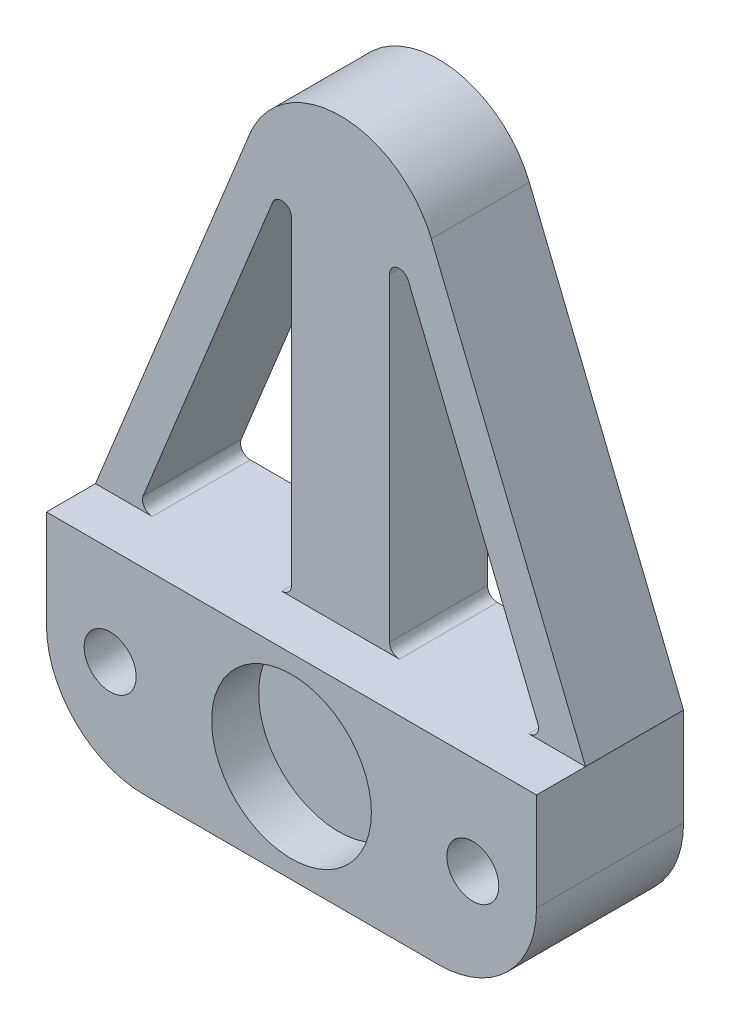
ISO-10303-21;
HEADER;
FILE_DESCRIPTION(('STEP AP214'),'2;1');
FILE_NAME('part.step','',(''),(''),'','','');
FILE_SCHEMA(('AUTOMOTIVE_DESIGN { 1 0 10303 214 1 1 1 1 }'));
ENDSEC;
DATA;
#1=APPLICATION_CONTEXT('core data for automotive mechanical design processes');
#2=APPLICATION_PROTOCOL_DEFINITION('international standard','automotive_design',2000,#1);
#3=PRODUCT_CONTEXT('',#1,'mechanical');
#4=PRODUCT('Part','Part','',(#3));
#5=PRODUCT_RELATED_PRODUCT_CATEGORY('part','',(#4));
#6=PRODUCT_DEFINITION_FORMATION('','',#4);
#7=PRODUCT_DEFINITION_CONTEXT('part definition',#1,'design');
#8=PRODUCT_DEFINITION('design','',#6,#7);
#9=PRODUCT_DEFINITION_SHAPE('','',#8);
#10=(LENGTH_UNIT() NAMED_UNIT(*) SI_UNIT(.MILLI.,.METRE.));
#11=(NAMED_UNIT(*) PLANE_ANGLE_UNIT() SI_UNIT($,.RADIAN.));
#12=(NAMED_UNIT(*) SI_UNIT($,.STERADIAN.) SOLID_ANGLE_UNIT());
#13=UNCERTAINTY_MEASURE_WITH_UNIT(LENGTH_MEASURE(1.E-05),#10,'distance_accuracy_value','');
#14=(GEOMETRIC_REPRESENTATION_CONTEXT(3) GLOBAL_UNCERTAINTY_ASSIGNED_CONTEXT((#13)) GLOBAL_UNIT_ASSIGNED_CONTEXT((#10,
#11,#12)) REPRESENTATION_CONTEXT('',''));
#15=CARTESIAN_POINT('',(0.,0.,0.));
#16=DIRECTION('',(0.,0.,1.));
#17=DIRECTION('',(1.,0.,0.));
#18=AXIS2_PLACEMENT_3D('',#15,#16,#17);
#19=CARTESIAN_POINT('',(0.,45.,6.));
#20=DIRECTION('',(0.,0.,-1.));
#21=DIRECTION('',(-1.,0.,0.));
#22=AXIS2_PLACEMENT_3D('',#19,#20,#21);
#23=CYLINDRICAL_SURFACE('',#22,8.2);
#24=CARTESIAN_POINT('',(0.,45.,0.));
#25=DIRECTION('',(0.,0.,-1.));
#26=DIRECTION('',(-1.,0.,0.));
#27=AXIS2_PLACEMENT_3D('',#24,#25,#26);
#28=CIRCLE('',#27,8.2);
#29=CARTESIAN_POINT('',(-7.66166921648798,42.0778732373286,0.));
#30=VERTEX_POINT('',#29);
#31=CARTESIAN_POINT('',(7.66166921648798,42.0778732373286,0.));
#32=VERTEX_POINT('',#31);
#33=EDGE_CURVE('E224',#30,#32,#28,.T.);
#34=ORIENTED_EDGE('',*,*,#33,.T.);
#35=DIRECTION('',(0.,0.,-1.));
#36=VECTOR('',#35,1.);
#37=CARTESIAN_POINT('',(7.66166921648798,42.0778732373286,6.));
#38=LINE('',#37,#36);
#39=CARTESIAN_POINT('',(7.66166921648798,42.0778732373286,6.));
#40=VERTEX_POINT('',#39);
#41=EDGE_CURVE('E240',#32,#40,#38,.F.);
#42=ORIENTED_EDGE('',*,*,#41,.T.);
#43=CARTESIAN_POINT('',(0.,45.,6.));
#44=DIRECTION('',(0.,0.,-1.));
#45=DIRECTION('',(-1.,0.,0.));
#46=AXIS2_PLACEMENT_3D('',#43,#44,#45);
#47=CIRCLE('',#46,8.2);
#48=CARTESIAN_POINT('',(-7.66166921648798,42.0778732373286,6.));
#49=VERTEX_POINT('',#48);
#50=EDGE_CURVE('E226',#49,#40,#47,.T.);
#51=ORIENTED_EDGE('',*,*,#50,.F.);
#52=DIRECTION('',(0.,0.,-1.));
#53=VECTOR('',#52,1.);
#54=CARTESIAN_POINT('',(-7.66166921648798,42.0778732373286,6.));
#55=LINE('',#54,#53);
#56=EDGE_CURVE('E210',#49,#30,#55,.T.);
#57=ORIENTED_EDGE('',*,*,#56,.T.);
#58=EDGE_LOOP('',(#34,#42,#51,#57));
#59=FACE_BOUND('',#58,.T.);
#60=ADVANCED_FACE('F36',(#59),#23,.F.);
#61=CARTESIAN_POINT('',(0.,0.,15.));
#62=DIRECTION('',(0.,0.,1.));
#63=DIRECTION('',(1.,0.,0.));
#64=AXIS2_PLACEMENT_3D('',#61,#62,#63);
#65=PLANE('',#64);
#66=CARTESIAN_POINT('',(0.,0.,15.));
#67=DIRECTION('',(0.,0.,1.));
#68=DIRECTION('',(1.,0.,0.));
#69=AXIS2_PLACEMENT_3D('',#66,#67,#68);
#70=CIRCLE('',#69,8.15);
#71=CARTESIAN_POINT('',(8.15,0.,15.));
#72=VERTEX_POINT('',#71);
#73=EDGE_CURVE('E271',#72,#72,#70,.T.);
#74=ORIENTED_EDGE('',*,*,#73,.F.);
#75=EDGE_LOOP('',(#74));
#76=FACE_BOUND('',#75,.T.);
#77=CARTESIAN_POINT('',(-18.5,0.,15.));
#78=DIRECTION('',(0.,0.,1.));
#79=DIRECTION('',(1.,0.,0.));
#80=AXIS2_PLACEMENT_3D('',#77,#78,#79);
#81=CIRCLE('',#80,2.65);
#82=CARTESIAN_POINT('',(-15.85,0.,15.));
#83=VERTEX_POINT('',#82);
#84=EDGE_CURVE('E296',#83,#83,#81,.T.);
#85=ORIENTED_EDGE('',*,*,#84,.F.);
#86=EDGE_LOOP('',(#85));
#87=FACE_BOUND('',#86,.T.);
#88=DIRECTION('',(0.,-1.,0.));
#89=VECTOR('',#88,1.);
#90=CARTESIAN_POINT('',(-25.,-10.,15.));
#91=LINE('',#90,#89);
#92=CARTESIAN_POINT('',(-25.,10.,15.));
#93=VERTEX_POINT('',#92);
#94=CARTESIAN_POINT('',(-25.,0.,15.));
#95=VERTEX_POINT('',#94);
#96=EDGE_CURVE('E302',#93,#95,#91,.T.);
#97=ORIENTED_EDGE('',*,*,#96,.T.);
#98=CARTESIAN_POINT('',(-15.,0.,15.));
#99=DIRECTION('',(0.,0.,1.));
#100=DIRECTION('',(1.,0.,0.));
#101=AXIS2_PLACEMENT_3D('',#98,#99,#100);
#102=CIRCLE('',#101,10.);
#103=CARTESIAN_POINT('',(-15.,-10.,15.));
#104=VERTEX_POINT('',#103);
#105=EDGE_CURVE('E44',#95,#104,#102,.T.);
#106=ORIENTED_EDGE('',*,*,#105,.T.);
#107=DIRECTION('',(1.,0.,0.));
#108=VECTOR('',#107,1.);
#109=CARTESIAN_POINT('',(25.,-9.99999999999999,15.));
#110=LINE('',#109,#108);
#111=CARTESIAN_POINT('',(15.,-10.,15.));
#112=VERTEX_POINT('',#111);
#113=EDGE_CURVE('E304',#104,#112,#110,.T.);
#114=ORIENTED_EDGE('',*,*,#113,.T.);
#115=CARTESIAN_POINT('',(15.,0.,15.));
#116=DIRECTION('',(0.,0.,1.));
#117=DIRECTION('',(1.,0.,0.));
#118=AXIS2_PLACEMENT_3D('',#115,#116,#117);
#119=CIRCLE('',#118,10.);
#120=CARTESIAN_POINT('',(25.,0.,15.));
#121=VERTEX_POINT('',#120);
#122=EDGE_CURVE('E51',#112,#121,#119,.T.);
#123=ORIENTED_EDGE('',*,*,#122,.T.);
#124=DIRECTION('',(0.,1.,0.));
#125=VECTOR('',#124,1.);
#126=CARTESIAN_POINT('',(25.,-9.99999999999999,15.));
#127=LINE('',#126,#125);
#128=CARTESIAN_POINT('',(25.,10.,15.));
#129=VERTEX_POINT('',#128);
#130=EDGE_CURVE('E307',#121,#129,#127,.T.);
#131=ORIENTED_EDGE('',*,*,#130,.T.);
#132=DIRECTION('',(-1.,0.,0.));
#133=VECTOR('',#132,1.);
#134=CARTESIAN_POINT('',(25.,10.,15.));
#135=LINE('',#134,#133);
#136=EDGE_CURVE('E309',#129,#93,#135,.T.);
#137=ORIENTED_EDGE('',*,*,#136,.T.);
#138=EDGE_LOOP('',(#97,#106,#114,#123,#131,#137));
#139=FACE_BOUND('',#138,.T.);
#140=CARTESIAN_POINT('',(18.5,0.,15.));
#141=DIRECTION('',(0.,0.,1.));
#142=DIRECTION('',(1.,0.,0.));
#143=AXIS2_PLACEMENT_3D('',#140,#141,#142);
#144=CIRCLE('',#143,2.65);
#145=CARTESIAN_POINT('',(21.15,0.,15.));
#146=VERTEX_POINT('',#145);
#147=EDGE_CURVE('E290',#146,#146,#144,.T.);
#148=ORIENTED_EDGE('',*,*,#147,.F.);
#149=EDGE_LOOP('',(#148));
#150=FACE_BOUND('',#149,.T.);
#151=ADVANCED_FACE('F399',(#76,#87,#139,#150),#65,.T.);
#152=CARTESIAN_POINT('',(0.,0.,0.));
#153=DIRECTION('',(0.,0.,1.));
#154=DIRECTION('',(1.,0.,0.));
#155=AXIS2_PLACEMENT_3D('',#152,#153,#154);
#156=PLANE('',#155);
#157=DIRECTION('',(-1.,0.,0.));
#158=VECTOR('',#157,1.);
#159=CARTESIAN_POINT('',(5.,10.,0.));
#160=LINE('',#159,#158);
#161=CARTESIAN_POINT('',(19.1978264720834,10.,0.));
#162=VERTEX_POINT('',#161);
#163=CARTESIAN_POINT('',(6.,10.,0.));
#164=VERTEX_POINT('',#163);
#165=EDGE_CURVE('E217',#162,#164,#160,.T.);
#166=ORIENTED_EDGE('',*,*,#165,.F.);
#167=CARTESIAN_POINT('',(19.1978264720834,11.,0.));
#168=DIRECTION('',(0.,0.,1.));
#169=DIRECTION('',(1.,0.,0.));
#170=AXIS2_PLACEMENT_3D('',#167,#168,#169);
#171=CIRCLE('',#170,1.);
#172=CARTESIAN_POINT('',(20.1243967674535,11.3761216395501,0.));
#173=VERTEX_POINT('',#172);
#174=EDGE_CURVE('E382',#162,#173,#171,.T.);
#175=ORIENTED_EDGE('',*,*,#174,.T.);
#176=DIRECTION('',(0.376121639550051,-0.926570295370072,0.));
#177=VECTOR('',#176,1.);
#178=CARTESIAN_POINT('',(20.6830042793435,10.,0.));
#179=LINE('',#178,#177);
#180=EDGE_CURVE('E228',#32,#173,#179,.T.);
#181=ORIENTED_EDGE('',*,*,#180,.F.);
#182=ORIENTED_EDGE('',*,*,#33,.F.);
#183=DIRECTION('',(0.376121639550051,0.926570295370072,0.));
#184=VECTOR('',#183,1.);
#185=CARTESIAN_POINT('',(-20.6830042793435,10.,0.));
#186=LINE('',#185,#184);
#187=CARTESIAN_POINT('',(-20.1243967674535,11.37612163955,0.));
#188=VERTEX_POINT('',#187);
#189=EDGE_CURVE('E206',#188,#30,#186,.T.);
#190=ORIENTED_EDGE('',*,*,#189,.F.);
#191=CARTESIAN_POINT('',(-19.1978264720834,11.,0.));
#192=DIRECTION('',(0.,0.,1.));
#193=DIRECTION('',(1.,0.,0.));
#194=AXIS2_PLACEMENT_3D('',#191,#192,#193);
#195=CIRCLE('',#194,1.);
#196=CARTESIAN_POINT('',(-19.1978264720834,10.,0.));
#197=VERTEX_POINT('',#196);
#198=EDGE_CURVE('E365',#188,#197,#195,.T.);
#199=ORIENTED_EDGE('',*,*,#198,.T.);
#200=DIRECTION('',(-1.,0.,0.));
#201=VECTOR('',#200,1.);
#202=CARTESIAN_POINT('',(-5.,10.,0.));
#203=LINE('',#202,#201);
#204=CARTESIAN_POINT('',(-6.,10.,0.));
#205=VERTEX_POINT('',#204);
#206=EDGE_CURVE('E218',#205,#197,#203,.T.);
#207=ORIENTED_EDGE('',*,*,#206,.F.);
#208=CARTESIAN_POINT('',(-6.,11.,0.));
#209=DIRECTION('',(0.,0.,1.));
#210=DIRECTION('',(1.,0.,0.));
#211=AXIS2_PLACEMENT_3D('',#208,#209,#210);
#212=CIRCLE('',#211,1.);
#213=CARTESIAN_POINT('',(-5.,11.,0.));
#214=VERTEX_POINT('',#213);
#215=EDGE_CURVE('E369',#205,#214,#212,.T.);
#216=ORIENTED_EDGE('',*,*,#215,.T.);
#217=DIRECTION('',(0.,-1.,0.));
#218=VECTOR('',#217,1.);
#219=CARTESIAN_POINT('',(-5.,48.6348573955626,0.));
#220=LINE('',#219,#218);
#221=CARTESIAN_POINT('',(-5.,38.5007692762912,0.));
#222=VERTEX_POINT('',#221);
#223=EDGE_CURVE('E511',#222,#214,#220,.T.);
#224=ORIENTED_EDGE('',*,*,#223,.F.);
#225=CARTESIAN_POINT('',(5.,38.5007692762912,0.));
#226=VERTEX_POINT('',#225);
#227=EDGE_CURVE('E235',#226,#222,#28,.T.);
#228=ORIENTED_EDGE('',*,*,#227,.F.);
#229=DIRECTION('',(0.,1.,0.));
#230=VECTOR('',#229,1.);
#231=CARTESIAN_POINT('',(5.,48.6348573955626,0.));
#232=LINE('',#231,#230);
#233=CARTESIAN_POINT('',(5.,11.,0.));
#234=VERTEX_POINT('',#233);
#235=EDGE_CURVE('E504',#234,#226,#232,.T.);
#236=ORIENTED_EDGE('',*,*,#235,.F.);
#237=CARTESIAN_POINT('',(6.,11.,0.));
#238=DIRECTION('',(0.,0.,1.));
#239=DIRECTION('',(1.,0.,0.));
#240=AXIS2_PLACEMENT_3D('',#237,#238,#239);
#241=CIRCLE('',#240,1.);
#242=EDGE_CURVE('E378',#234,#164,#241,.T.);
#243=ORIENTED_EDGE('',*,*,#242,.T.);
#244=EDGE_LOOP('',(#166,#175,#181,#182,#190,#199,#207,#216,#224,#228,#236,#243));
#245=FACE_BOUND('',#244,.T.);
#246=CARTESIAN_POINT('',(0.,0.,0.));
#247=DIRECTION('',(0.,0.,-1.));
#248=DIRECTION('',(-1.,0.,0.));
#249=AXIS2_PLACEMENT_3D('',#246,#247,#248);
#250=CIRCLE('',#249,5.175);
#251=CARTESIAN_POINT('',(-5.175,0.,0.));
#252=VERTEX_POINT('',#251);
#253=EDGE_CURVE('E281',#252,#252,#250,.T.);
#254=ORIENTED_EDGE('',*,*,#253,.F.);
#255=EDGE_LOOP('',(#254));
#256=FACE_BOUND('',#255,.T.);
#257=DIRECTION('',(1.,0.,0.));
#258=VECTOR('',#257,1.);
#259=CARTESIAN_POINT('',(25.,-9.99999999999999,0.));
#260=LINE('',#259,#258);
#261=CARTESIAN_POINT('',(-15.,-10.,0.));
#262=VERTEX_POINT('',#261);
#263=CARTESIAN_POINT('',(15.,-10.,0.));
#264=VERTEX_POINT('',#263);
#265=EDGE_CURVE('E313',#262,#264,#260,.T.);
#266=ORIENTED_EDGE('',*,*,#265,.F.);
#267=CARTESIAN_POINT('',(-15.,0.,0.));
#268=DIRECTION('',(0.,0.,1.));
#269=DIRECTION('',(1.,0.,0.));
#270=AXIS2_PLACEMENT_3D('',#267,#268,#269);
#271=CIRCLE('',#270,10.);
#272=CARTESIAN_POINT('',(-25.,0.,0.));
#273=VERTEX_POINT('',#272);
#274=EDGE_CURVE('E394',#262,#273,#271,.F.);
#275=ORIENTED_EDGE('',*,*,#274,.T.);
#276=DIRECTION('',(0.,-1.,0.));
#277=VECTOR('',#276,1.);
#278=CARTESIAN_POINT('',(-25.,-10.,0.));
#279=LINE('',#278,#277);
#280=CARTESIAN_POINT('',(-25.,10.,0.));
#281=VERTEX_POINT('',#280);
#282=EDGE_CURVE('E299',#281,#273,#279,.T.);
#283=ORIENTED_EDGE('',*,*,#282,.F.);
#284=DIRECTION('',(0.376121639550051,0.926570295370071,0.));
#285=VECTOR('',#284,1.);
#286=CARTESIAN_POINT('',(-25.,10.,0.));
#287=LINE('',#286,#285);
#288=CARTESIAN_POINT('',(-9.26570295370072,48.7612163955005,0.));
#289=VERTEX_POINT('',#288);
#290=EDGE_CURVE('E258',#281,#289,#287,.T.);
#291=ORIENTED_EDGE('',*,*,#290,.T.);
#292=CARTESIAN_POINT('',(0.,45.,0.));
#293=DIRECTION('',(0.,0.,-1.));
#294=DIRECTION('',(-1.,0.,0.));
#295=AXIS2_PLACEMENT_3D('',#292,#293,#294);
#296=CIRCLE('',#295,10.);
#297=CARTESIAN_POINT('',(9.26570295370072,48.7612163955005,0.));
#298=VERTEX_POINT('',#297);
#299=EDGE_CURVE('E261',#289,#298,#296,.T.);
#300=ORIENTED_EDGE('',*,*,#299,.T.);
#301=DIRECTION('',(0.376121639550051,-0.926570295370072,0.));
#302=VECTOR('',#301,1.);
#303=CARTESIAN_POINT('',(9.26570295370072,48.7612163955005,0.));
#304=LINE('',#303,#302);
#305=CARTESIAN_POINT('',(25.,10.,0.));
#306=VERTEX_POINT('',#305);
#307=EDGE_CURVE('E265',#298,#306,#304,.T.);
#308=ORIENTED_EDGE('',*,*,#307,.T.);
#309=DIRECTION('',(0.,1.,0.));
#310=VECTOR('',#309,1.);
#311=CARTESIAN_POINT('',(25.,-9.99999999999999,0.));
#312=LINE('',#311,#310);
#313=CARTESIAN_POINT('',(25.,0.,0.));
#314=VERTEX_POINT('',#313);
#315=EDGE_CURVE('E305',#314,#306,#312,.T.);
#316=ORIENTED_EDGE('',*,*,#315,.F.);
#317=CARTESIAN_POINT('',(15.,0.,0.));
#318=DIRECTION('',(0.,0.,1.));
#319=DIRECTION('',(1.,0.,0.));
#320=AXIS2_PLACEMENT_3D('',#317,#318,#319);
#321=CIRCLE('',#320,10.);
#322=EDGE_CURVE('E392',#314,#264,#321,.F.);
#323=ORIENTED_EDGE('',*,*,#322,.T.);
#324=EDGE_LOOP('',(#266,#275,#283,#291,#300,#308,#316,#323));
#325=FACE_BOUND('',#324,.T.);
#326=CARTESIAN_POINT('',(-18.5,0.,0.));
#327=DIRECTION('',(0.,0.,1.));
#328=DIRECTION('',(1.,0.,0.));
#329=AXIS2_PLACEMENT_3D('',#326,#327,#328);
#330=CIRCLE('',#329,2.65);
#331=CARTESIAN_POINT('',(-15.85,0.,0.));
#332=VERTEX_POINT('',#331);
#333=EDGE_CURVE('E293',#332,#332,#330,.T.);
#334=ORIENTED_EDGE('',*,*,#333,.T.);
#335=EDGE_LOOP('',(#334));
#336=FACE_BOUND('',#335,.T.);
#337=CARTESIAN_POINT('',(18.5,0.,0.));
#338=DIRECTION('',(0.,0.,1.));
#339=DIRECTION('',(1.,0.,0.));
#340=AXIS2_PLACEMENT_3D('',#337,#338,#339);
#341=CIRCLE('',#340,2.65);
#342=CARTESIAN_POINT('',(21.15,0.,0.));
#343=VERTEX_POINT('',#342);
#344=EDGE_CURVE('E287',#343,#343,#341,.T.);
#345=ORIENTED_EDGE('',*,*,#344,.T.);
#346=EDGE_LOOP('',(#345));
#347=FACE_BOUND('',#346,.T.);
#348=ADVANCED_FACE('F232',(#245,#256,#325,#336,#347),#156,.F.);
#349=CARTESIAN_POINT('',(-25.,-10.,15.));
#350=DIRECTION('',(1.,0.,0.));
#351=DIRECTION('',(0.,1.,0.));
#352=AXIS2_PLACEMENT_3D('',#349,#350,#351);
#353=PLANE('',#352);
#354=ORIENTED_EDGE('',*,*,#282,.T.);
#355=DIRECTION('',(0.,0.,-1.));
#356=VECTOR('',#355,1.);
#357=CARTESIAN_POINT('',(-25.,0.,15.));
#358=LINE('',#357,#356);
#359=EDGE_CURVE('E59',#273,#95,#358,.F.);
#360=ORIENTED_EDGE('',*,*,#359,.T.);
#361=ORIENTED_EDGE('',*,*,#96,.F.);
#362=DIRECTION('',(0.,0.,-1.));
#363=VECTOR('',#362,1.);
#364=CARTESIAN_POINT('',(-25.,10.,15.));
#365=LINE('',#364,#363);
#366=CARTESIAN_POINT('',(-25.,10.,10.));
#367=VERTEX_POINT('',#366);
#368=EDGE_CURVE('E311',#93,#367,#365,.T.);
#369=ORIENTED_EDGE('',*,*,#368,.T.);
#370=DIRECTION('',(0.,0.,-1.));
#371=VECTOR('',#370,1.);
#372=CARTESIAN_POINT('',(-25.,10.,10.));
#373=LINE('',#372,#371);
#374=EDGE_CURVE('E257',#367,#281,#373,.T.);
#375=ORIENTED_EDGE('',*,*,#374,.T.);
#376=EDGE_LOOP('',(#354,#360,#361,#369,#375));
#377=FACE_BOUND('',#376,.T.);
#378=ADVANCED_FACE('F411',(#377),#353,.F.);
#379=CARTESIAN_POINT('',(25.,-9.99999999999999,15.));
#380=DIRECTION('',(0.,1.,0.));
#381=DIRECTION('',(-1.,0.,0.));
#382=AXIS2_PLACEMENT_3D('',#379,#380,#381);
#383=PLANE('',#382);
#384=ORIENTED_EDGE('',*,*,#113,.F.);
#385=DIRECTION('',(0.,0.,-1.));
#386=VECTOR('',#385,1.);
#387=CARTESIAN_POINT('',(-15.,-10.,15.));
#388=LINE('',#387,#386);
#389=EDGE_CURVE('E389',#104,#262,#388,.T.);
#390=ORIENTED_EDGE('',*,*,#389,.T.);
#391=ORIENTED_EDGE('',*,*,#265,.T.);
#392=DIRECTION('',(0.,0.,-1.));
#393=VECTOR('',#392,1.);
#394=CARTESIAN_POINT('',(15.,-10.,15.));
#395=LINE('',#394,#393);
#396=EDGE_CURVE('E387',#264,#112,#395,.F.);
#397=ORIENTED_EDGE('',*,*,#396,.T.);
#398=EDGE_LOOP('',(#384,#390,#391,#397));
#399=FACE_BOUND('',#398,.T.);
#400=ADVANCED_FACE('F404',(#399),#383,.F.);
#401=CARTESIAN_POINT('',(25.,-9.99999999999999,15.));
#402=DIRECTION('',(-1.,0.,0.));
#403=DIRECTION('',(0.,0.,1.));
#404=AXIS2_PLACEMENT_3D('',#401,#402,#403);
#405=PLANE('',#404);
#406=ORIENTED_EDGE('',*,*,#130,.F.);
#407=DIRECTION('',(0.,0.,-1.));
#408=VECTOR('',#407,1.);
#409=CARTESIAN_POINT('',(25.,0.,15.));
#410=LINE('',#409,#408);
#411=EDGE_CURVE('E11',#121,#314,#410,.T.);
#412=ORIENTED_EDGE('',*,*,#411,.T.);
#413=ORIENTED_EDGE('',*,*,#315,.T.);
#414=DIRECTION('',(0.,0.,-1.));
#415=VECTOR('',#414,1.);
#416=CARTESIAN_POINT('',(25.,10.,10.));
#417=LINE('',#416,#415);
#418=CARTESIAN_POINT('',(25.,10.,10.));
#419=VERTEX_POINT('',#418);
#420=EDGE_CURVE('E268',#419,#306,#417,.T.);
#421=ORIENTED_EDGE('',*,*,#420,.F.);
#422=DIRECTION('',(0.,0.,-1.));
#423=VECTOR('',#422,1.);
#424=CARTESIAN_POINT('',(25.,10.,15.));
#425=LINE('',#424,#423);
#426=EDGE_CURVE('E319',#129,#419,#425,.T.);
#427=ORIENTED_EDGE('',*,*,#426,.F.);
#428=EDGE_LOOP('',(#406,#412,#413,#421,#427));
#429=FACE_BOUND('',#428,.T.);
#430=ADVANCED_FACE('F427',(#429),#405,.F.);
#431=CARTESIAN_POINT('',(25.,10.,15.));
#432=DIRECTION('',(0.,-1.,0.));
#433=DIRECTION('',(1.,0.,0.));
#434=AXIS2_PLACEMENT_3D('',#431,#432,#433);
#435=PLANE('',#434);
#436=ORIENTED_EDGE('',*,*,#206,.T.);
#437=DIRECTION('',(0.,0.,-1.));
#438=VECTOR('',#437,1.);
#439=CARTESIAN_POINT('',(-19.1978264720834,10.,10.));
#440=LINE('',#439,#438);
#441=CARTESIAN_POINT('',(-19.1978264720834,10.,10.));
#442=VERTEX_POINT('',#441);
#443=EDGE_CURVE('E348',#197,#442,#440,.F.);
#444=ORIENTED_EDGE('',*,*,#443,.T.);
#445=DIRECTION('',(-1.,0.,0.));
#446=VECTOR('',#445,1.);
#447=CARTESIAN_POINT('',(-25.,10.,10.));
#448=LINE('',#447,#446);
#449=EDGE_CURVE('E248',#442,#367,#448,.T.);
#450=ORIENTED_EDGE('',*,*,#449,.T.);
#451=ORIENTED_EDGE('',*,*,#368,.F.);
#452=ORIENTED_EDGE('',*,*,#136,.F.);
#453=ORIENTED_EDGE('',*,*,#426,.T.);
#454=CARTESIAN_POINT('',(19.1978264720834,10.,10.));
#455=VERTEX_POINT('',#454);
#456=EDGE_CURVE('E244',#419,#455,#448,.T.);
#457=ORIENTED_EDGE('',*,*,#456,.T.);
#458=DIRECTION('',(0.,0.,-1.));
#459=VECTOR('',#458,1.);
#460=CARTESIAN_POINT('',(19.1978264720834,10.,0.));
#461=LINE('',#460,#459);
#462=EDGE_CURVE('E339',#455,#162,#461,.T.);
#463=ORIENTED_EDGE('',*,*,#462,.T.);
#464=ORIENTED_EDGE('',*,*,#165,.T.);
#465=DIRECTION('',(0.,0.,-1.));
#466=VECTOR('',#465,1.);
#467=CARTESIAN_POINT('',(6.,10.,10.));
#468=LINE('',#467,#466);
#469=CARTESIAN_POINT('',(5.99999999999999,10.,10.));
#470=VERTEX_POINT('',#469);
#471=EDGE_CURVE('E342',#164,#470,#468,.F.);
#472=ORIENTED_EDGE('',*,*,#471,.T.);
#473=CARTESIAN_POINT('',(-6.,10.,10.));
#474=VERTEX_POINT('',#473);
#475=EDGE_CURVE('E247',#470,#474,#448,.T.);
#476=ORIENTED_EDGE('',*,*,#475,.T.);
#477=DIRECTION('',(0.,0.,-1.));
#478=VECTOR('',#477,1.);
#479=CARTESIAN_POINT('',(-6.,10.,0.));
#480=LINE('',#479,#478);
#481=EDGE_CURVE('E345',#474,#205,#480,.T.);
#482=ORIENTED_EDGE('',*,*,#481,.T.);
#483=EDGE_LOOP('',(#436,#444,#450,#451,#452,#453,#457,#463,#464,#472,#476,#482));
#484=FACE_BOUND('',#483,.T.);
#485=ADVANCED_FACE('F431',(#484),#435,.F.);
#486=CARTESIAN_POINT('',(-18.5,0.,15.));
#487=DIRECTION('',(0.,0.,-1.));
#488=DIRECTION('',(-1.,0.,0.));
#489=AXIS2_PLACEMENT_3D('',#486,#487,#488);
#490=CYLINDRICAL_SURFACE('',#489,2.65);
#491=ORIENTED_EDGE('',*,*,#84,.T.);
#492=EDGE_LOOP('',(#491));
#493=FACE_BOUND('',#492,.T.);
#494=ORIENTED_EDGE('',*,*,#333,.F.);
#495=EDGE_LOOP('',(#494));
#496=FACE_BOUND('',#495,.T.);
#497=ADVANCED_FACE('F574',(#493,#496),#490,.F.);
#498=CARTESIAN_POINT('',(18.5,0.,15.));
#499=DIRECTION('',(0.,0.,-1.));
#500=DIRECTION('',(-1.,0.,0.));
#501=AXIS2_PLACEMENT_3D('',#498,#499,#500);
#502=CYLINDRICAL_SURFACE('',#501,2.65);
#503=ORIENTED_EDGE('',*,*,#147,.T.);
#504=EDGE_LOOP('',(#503));
#505=FACE_BOUND('',#504,.T.);
#506=ORIENTED_EDGE('',*,*,#344,.F.);
#507=EDGE_LOOP('',(#506));
#508=FACE_BOUND('',#507,.T.);
#509=ADVANCED_FACE('F570',(#505,#508),#502,.F.);
#510=CARTESIAN_POINT('',(0.,0.,5.5));
#511=DIRECTION('',(0.,0.,-1.));
#512=DIRECTION('',(-1.,0.,0.));
#513=AXIS2_PLACEMENT_3D('',#510,#511,#512);
#514=CYLINDRICAL_SURFACE('',#513,5.175);
#515=CARTESIAN_POINT('',(0.,0.,5.5));
#516=DIRECTION('',(0.,0.,-1.));
#517=DIRECTION('',(-1.,0.,0.));
#518=AXIS2_PLACEMENT_3D('',#515,#516,#517);
#519=CIRCLE('',#518,5.175);
#520=CARTESIAN_POINT('',(-5.175,0.,5.5));
#521=VERTEX_POINT('',#520);
#522=EDGE_CURVE('E284',#521,#521,#519,.T.);
#523=ORIENTED_EDGE('',*,*,#522,.F.);
#524=EDGE_LOOP('',(#523));
#525=FACE_BOUND('',#524,.T.);
#526=ORIENTED_EDGE('',*,*,#253,.T.);
#527=EDGE_LOOP('',(#526));
#528=FACE_BOUND('',#527,.T.);
#529=ADVANCED_FACE('F566',(#525,#528),#514,.F.);
#530=CARTESIAN_POINT('',(0.,0.,5.5));
#531=DIRECTION('',(0.,0.,-1.));
#532=DIRECTION('',(-1.,0.,0.));
#533=AXIS2_PLACEMENT_3D('',#530,#531,#532);
#534=PLANE('',#533);
#535=ORIENTED_EDGE('',*,*,#522,.T.);
#536=EDGE_LOOP('',(#535));
#537=FACE_BOUND('',#536,.T.);
#538=ADVANCED_FACE('F562',(#537),#534,.T.);
#539=CARTESIAN_POINT('',(0.,0.,10.2));
#540=DIRECTION('',(0.,0.,1.));
#541=DIRECTION('',(1.,0.,0.));
#542=AXIS2_PLACEMENT_3D('',#539,#540,#541);
#543=CYLINDRICAL_SURFACE('',#542,8.15);
#544=CARTESIAN_POINT('',(0.,0.,10.2));
#545=DIRECTION('',(0.,0.,1.));
#546=DIRECTION('',(1.,0.,0.));
#547=AXIS2_PLACEMENT_3D('',#544,#545,#546);
#548=CIRCLE('',#547,8.15);
#549=CARTESIAN_POINT('',(8.15,0.,10.2));
#550=VERTEX_POINT('',#549);
#551=EDGE_CURVE('E278',#550,#550,#548,.T.);
#552=ORIENTED_EDGE('',*,*,#551,.F.);
#553=EDGE_LOOP('',(#552));
#554=FACE_BOUND('',#553,.T.);
#555=ORIENTED_EDGE('',*,*,#73,.T.);
#556=EDGE_LOOP('',(#555));
#557=FACE_BOUND('',#556,.T.);
#558=ADVANCED_FACE('F558',(#554,#557),#543,.F.);
#559=CARTESIAN_POINT('',(0.,0.,10.2));
#560=DIRECTION('',(0.,0.,1.));
#561=DIRECTION('',(1.,0.,0.));
#562=AXIS2_PLACEMENT_3D('',#559,#560,#561);
#563=PLANE('',#562);
#564=ORIENTED_EDGE('',*,*,#551,.T.);
#565=EDGE_LOOP('',(#564));
#566=FACE_BOUND('',#565,.T.);
#567=ADVANCED_FACE('F553',(#566),#563,.T.);
#568=CARTESIAN_POINT('',(9.26570295370072,48.7612163955005,10.));
#569=DIRECTION('',(0.926570295370071,0.376121639550051,0.));
#570=DIRECTION('',(-0.376121639550051,0.926570295370072,0.));
#571=AXIS2_PLACEMENT_3D('',#568,#569,#570);
#572=PLANE('',#571);
#573=ORIENTED_EDGE('',*,*,#307,.F.);
#574=DIRECTION('',(0.,0.,-1.));
#575=VECTOR('',#574,1.);
#576=CARTESIAN_POINT('',(9.26570295370072,48.7612163955005,10.));
#577=LINE('',#576,#575);
#578=CARTESIAN_POINT('',(9.26570295370072,48.7612163955005,10.));
#579=VERTEX_POINT('',#578);
#580=EDGE_CURVE('E272',#579,#298,#577,.T.);
#581=ORIENTED_EDGE('',*,*,#580,.F.);
#582=DIRECTION('',(0.376121639550051,-0.926570295370072,0.));
#583=VECTOR('',#582,1.);
#584=CARTESIAN_POINT('',(9.26570295370072,48.7612163955005,10.));
#585=LINE('',#584,#583);
#586=EDGE_CURVE('E254',#579,#419,#585,.T.);
#587=ORIENTED_EDGE('',*,*,#586,.T.);
#588=ORIENTED_EDGE('',*,*,#420,.T.);
#589=EDGE_LOOP('',(#573,#581,#587,#588));
#590=FACE_BOUND('',#589,.T.);
#591=ADVANCED_FACE('F422',(#590),#572,.T.);
#592=CARTESIAN_POINT('',(0.,45.,10.));
#593=DIRECTION('',(0.,0.,-1.));
#594=DIRECTION('',(-1.,0.,0.));
#595=AXIS2_PLACEMENT_3D('',#592,#593,#594);
#596=CYLINDRICAL_SURFACE('',#595,10.);
#597=ORIENTED_EDGE('',*,*,#299,.F.);
#598=DIRECTION('',(0.,0.,-1.));
#599=VECTOR('',#598,1.);
#600=CARTESIAN_POINT('',(-9.26570295370072,48.7612163955005,10.));
#601=LINE('',#600,#599);
#602=CARTESIAN_POINT('',(-9.26570295370072,48.7612163955005,10.));
#603=VERTEX_POINT('',#602);
#604=EDGE_CURVE('E274',#603,#289,#601,.T.);
#605=ORIENTED_EDGE('',*,*,#604,.F.);
#606=CARTESIAN_POINT('',(0.,45.,10.));
#607=DIRECTION('',(0.,0.,-1.));
#608=DIRECTION('',(-1.,0.,0.));
#609=AXIS2_PLACEMENT_3D('',#606,#607,#608);
#610=CIRCLE('',#609,10.);
#611=EDGE_CURVE('E251',#603,#579,#610,.T.);
#612=ORIENTED_EDGE('',*,*,#611,.T.);
#613=ORIENTED_EDGE('',*,*,#580,.T.);
#614=EDGE_LOOP('',(#597,#605,#612,#613));
#615=FACE_BOUND('',#614,.T.);
#616=ADVANCED_FACE('F545',(#615),#596,.T.);
#617=CARTESIAN_POINT('',(-25.,10.,10.));
#618=DIRECTION('',(-0.926570295370071,0.376121639550051,0.));
#619=DIRECTION('',(-0.376121639550051,-0.926570295370072,0.));
#620=AXIS2_PLACEMENT_3D('',#617,#618,#619);
#621=PLANE('',#620);
#622=ORIENTED_EDGE('',*,*,#290,.F.);
#623=ORIENTED_EDGE('',*,*,#374,.F.);
#624=DIRECTION('',(0.376121639550051,0.926570295370071,0.));
#625=VECTOR('',#624,1.);
#626=CARTESIAN_POINT('',(-25.,10.,10.));
#627=LINE('',#626,#625);
#628=EDGE_CURVE('E246',#367,#603,#627,.T.);
#629=ORIENTED_EDGE('',*,*,#628,.T.);
#630=ORIENTED_EDGE('',*,*,#604,.T.);
#631=EDGE_LOOP('',(#622,#623,#629,#630));
#632=FACE_BOUND('',#631,.T.);
#633=ADVANCED_FACE('F415',(#632),#621,.T.);
#634=CARTESIAN_POINT('',(0.,45.,10.));
#635=DIRECTION('',(0.,0.,-1.));
#636=DIRECTION('',(-1.,0.,0.));
#637=AXIS2_PLACEMENT_3D('',#634,#635,#636);
#638=PLANE('',#637);
#639=ORIENTED_EDGE('',*,*,#475,.F.);
#640=CARTESIAN_POINT('',(6.,11.,10.));
#641=DIRECTION('',(0.,0.,-1.));
#642=DIRECTION('',(-1.,0.,0.));
#643=AXIS2_PLACEMENT_3D('',#640,#641,#642);
#644=CIRCLE('',#643,1.);
#645=CARTESIAN_POINT('',(5.,11.,10.));
#646=VERTEX_POINT('',#645);
#647=EDGE_CURVE('E380',#470,#646,#644,.T.);
#648=ORIENTED_EDGE('',*,*,#647,.T.);
#649=DIRECTION('',(0.,1.,0.));
#650=VECTOR('',#649,1.);
#651=CARTESIAN_POINT('',(5.,45.,10.));
#652=LINE('',#651,#650);
#653=CARTESIAN_POINT('',(5.,43.5126573071157,10.));
#654=VERTEX_POINT('',#653);
#655=EDGE_CURVE('E484',#646,#654,#652,.T.);
#656=ORIENTED_EDGE('',*,*,#655,.T.);
#657=CARTESIAN_POINT('',(6.,43.5126573071157,10.));
#658=DIRECTION('',(0.,0.,-1.));
#659=DIRECTION('',(-1.,0.,0.));
#660=AXIS2_PLACEMENT_3D('',#657,#658,#659);
#661=CIRCLE('',#660,1.);
#662=CARTESIAN_POINT('',(6.92657029537007,43.8887789466658,10.));
#663=VERTEX_POINT('',#662);
#664=EDGE_CURVE('E376',#654,#663,#661,.T.);
#665=ORIENTED_EDGE('',*,*,#664,.T.);
#666=DIRECTION('',(0.376121639550051,-0.926570295370072,0.));
#667=VECTOR('',#666,1.);
#668=CARTESIAN_POINT('',(5.55942177222044,47.2567298373003,10.));
#669=LINE('',#668,#667);
#670=CARTESIAN_POINT('',(20.1243967674535,11.37612163955,10.));
#671=VERTEX_POINT('',#670);
#672=EDGE_CURVE('E236',#663,#671,#669,.T.);
#673=ORIENTED_EDGE('',*,*,#672,.T.);
#674=CARTESIAN_POINT('',(19.1978264720834,11.,10.));
#675=DIRECTION('',(0.,0.,-1.));
#676=DIRECTION('',(-1.,0.,0.));
#677=AXIS2_PLACEMENT_3D('',#674,#675,#676);
#678=CIRCLE('',#677,1.);
#679=EDGE_CURVE('E384',#671,#455,#678,.T.);
#680=ORIENTED_EDGE('',*,*,#679,.T.);
#681=ORIENTED_EDGE('',*,*,#456,.F.);
#682=ORIENTED_EDGE('',*,*,#586,.F.);
#683=ORIENTED_EDGE('',*,*,#611,.F.);
#684=ORIENTED_EDGE('',*,*,#628,.F.);
#685=ORIENTED_EDGE('',*,*,#449,.F.);
#686=CARTESIAN_POINT('',(-19.1978264720834,11.,10.));
#687=DIRECTION('',(0.,0.,-1.));
#688=DIRECTION('',(-1.,0.,0.));
#689=AXIS2_PLACEMENT_3D('',#686,#687,#688);
#690=CIRCLE('',#689,1.);
#691=CARTESIAN_POINT('',(-20.1243967674535,11.37612163955,10.));
#692=VERTEX_POINT('',#691);
#693=EDGE_CURVE('E367',#442,#692,#690,.T.);
#694=ORIENTED_EDGE('',*,*,#693,.T.);
#695=DIRECTION('',(0.376121639550051,0.926570295370072,0.));
#696=VECTOR('',#695,1.);
#697=CARTESIAN_POINT('',(-5.55942177222044,47.2567298373003,10.));
#698=LINE('',#697,#696);
#699=CARTESIAN_POINT('',(-6.92657029537007,43.8887789466658,10.));
#700=VERTEX_POINT('',#699);
#701=EDGE_CURVE('E227',#692,#700,#698,.T.);
#702=ORIENTED_EDGE('',*,*,#701,.T.);
#703=CARTESIAN_POINT('',(-6.,43.5126573071157,10.));
#704=DIRECTION('',(0.,0.,-1.));
#705=DIRECTION('',(-1.,0.,0.));
#706=AXIS2_PLACEMENT_3D('',#703,#704,#705);
#707=CIRCLE('',#706,1.);
#708=CARTESIAN_POINT('',(-5.,43.5126573071157,10.));
#709=VERTEX_POINT('',#708);
#710=EDGE_CURVE('E363',#700,#709,#707,.T.);
#711=ORIENTED_EDGE('',*,*,#710,.T.);
#712=DIRECTION('',(0.,-1.,0.));
#713=VECTOR('',#712,1.);
#714=CARTESIAN_POINT('',(-5.,45.,10.));
#715=LINE('',#714,#713);
#716=CARTESIAN_POINT('',(-5.,11.,10.));
#717=VERTEX_POINT('',#716);
#718=EDGE_CURVE('E478',#709,#717,#715,.T.);
#719=ORIENTED_EDGE('',*,*,#718,.T.);
#720=CARTESIAN_POINT('',(-6.,11.,10.));
#721=DIRECTION('',(0.,0.,-1.));
#722=DIRECTION('',(-1.,0.,0.));
#723=AXIS2_PLACEMENT_3D('',#720,#721,#722);
#724=CIRCLE('',#723,1.);
#725=EDGE_CURVE('E371',#717,#474,#724,.T.);
#726=ORIENTED_EDGE('',*,*,#725,.T.);
#727=EDGE_LOOP('',(#639,#648,#656,#665,#673,#680,#681,#682,#683,#684,#685,#694,#702,#711,#719,#726));
#728=FACE_BOUND('',#727,.T.);
#729=ADVANCED_FACE('F451',(#728),#638,.F.);
#730=CARTESIAN_POINT('',(5.,38.5007692762912,6.));
#731=VERTEX_POINT('',#730);
#732=CARTESIAN_POINT('',(-5.,38.5007692762912,6.));
#733=VERTEX_POINT('',#732);
#734=EDGE_CURVE('E262',#731,#733,#47,.T.);
#735=ORIENTED_EDGE('',*,*,#734,.F.);
#736=DIRECTION('',(0.,0.,-1.));
#737=VECTOR('',#736,1.);
#738=CARTESIAN_POINT('',(5.,38.5007692762912,6.));
#739=LINE('',#738,#737);
#740=EDGE_CURVE('E464',#731,#226,#739,.T.);
#741=ORIENTED_EDGE('',*,*,#740,.T.);
#742=ORIENTED_EDGE('',*,*,#227,.T.);
#743=DIRECTION('',(0.,0.,-1.));
#744=VECTOR('',#743,1.);
#745=CARTESIAN_POINT('',(-5.,38.5007692762912,6.));
#746=LINE('',#745,#744);
#747=EDGE_CURVE('E466',#222,#733,#746,.F.);
#748=ORIENTED_EDGE('',*,*,#747,.T.);
#749=EDGE_LOOP('',(#735,#741,#742,#748));
#750=FACE_BOUND('',#749,.T.);
#751=ADVANCED_FACE('F441',(#750),#23,.F.);
#752=CARTESIAN_POINT('',(0.,45.,6.));
#753=DIRECTION('',(0.,0.,-1.));
#754=DIRECTION('',(-1.,0.,0.));
#755=AXIS2_PLACEMENT_3D('',#752,#753,#754);
#756=PLANE('',#755);
#757=DIRECTION('',(0.376121639550051,-0.926570295370072,0.));
#758=VECTOR('',#757,1.);
#759=CARTESIAN_POINT('',(5.55942177222044,47.2567298373003,6.));
#760=LINE('',#759,#758);
#761=CARTESIAN_POINT('',(6.92657029537007,43.8887789466658,6.));
#762=VERTEX_POINT('',#761);
#763=EDGE_CURVE('E329',#762,#40,#760,.T.);
#764=ORIENTED_EDGE('',*,*,#763,.F.);
#765=CARTESIAN_POINT('',(6.,43.5126573071157,6.));
#766=DIRECTION('',(0.,0.,-1.));
#767=DIRECTION('',(-1.,0.,0.));
#768=AXIS2_PLACEMENT_3D('',#765,#766,#767);
#769=CIRCLE('',#768,1.);
#770=CARTESIAN_POINT('',(5.,43.5126573071157,6.));
#771=VERTEX_POINT('',#770);
#772=EDGE_CURVE('E374',#762,#771,#769,.F.);
#773=ORIENTED_EDGE('',*,*,#772,.T.);
#774=DIRECTION('',(0.,1.,0.));
#775=VECTOR('',#774,1.);
#776=CARTESIAN_POINT('',(5.,45.,6.));
#777=LINE('',#776,#775);
#778=EDGE_CURVE('E326',#731,#771,#777,.T.);
#779=ORIENTED_EDGE('',*,*,#778,.F.);
#780=ORIENTED_EDGE('',*,*,#734,.T.);
#781=DIRECTION('',(0.,-1.,0.));
#782=VECTOR('',#781,1.);
#783=CARTESIAN_POINT('',(-5.,45.,6.));
#784=LINE('',#783,#782);
#785=CARTESIAN_POINT('',(-5.,43.5126573071157,6.));
#786=VERTEX_POINT('',#785);
#787=EDGE_CURVE('E324',#786,#733,#784,.T.);
#788=ORIENTED_EDGE('',*,*,#787,.F.);
#789=CARTESIAN_POINT('',(-6.,43.5126573071157,6.));
#790=DIRECTION('',(0.,0.,-1.));
#791=DIRECTION('',(-1.,0.,0.));
#792=AXIS2_PLACEMENT_3D('',#789,#790,#791);
#793=CIRCLE('',#792,1.);
#794=CARTESIAN_POINT('',(-6.92657029537007,43.8887789466658,6.));
#795=VERTEX_POINT('',#794);
#796=EDGE_CURVE('E361',#786,#795,#793,.F.);
#797=ORIENTED_EDGE('',*,*,#796,.T.);
#798=DIRECTION('',(0.376121639550051,0.926570295370072,0.));
#799=VECTOR('',#798,1.);
#800=CARTESIAN_POINT('',(-5.55942177222044,47.2567298373003,6.));
#801=LINE('',#800,#799);
#802=EDGE_CURVE('E322',#49,#795,#801,.T.);
#803=ORIENTED_EDGE('',*,*,#802,.F.);
#804=ORIENTED_EDGE('',*,*,#50,.T.);
#805=EDGE_LOOP('',(#764,#773,#779,#780,#788,#797,#803,#804));
#806=FACE_BOUND('',#805,.T.);
#807=ADVANCED_FACE('F450',(#806),#756,.T.);
#808=CARTESIAN_POINT('',(-5.,48.6348573955626,15.));
#809=DIRECTION('',(1.,0.,0.));
#810=DIRECTION('',(0.,1.,0.));
#811=AXIS2_PLACEMENT_3D('',#808,#809,#810);
#812=PLANE('',#811);
#813=ORIENTED_EDGE('',*,*,#718,.F.);
#814=DIRECTION('',(0.,0.,-1.));
#815=VECTOR('',#814,1.);
#816=CARTESIAN_POINT('',(-5.,43.5126573071157,6.));
#817=LINE('',#816,#815);
#818=EDGE_CURVE('E333',#709,#786,#817,.T.);
#819=ORIENTED_EDGE('',*,*,#818,.T.);
#820=ORIENTED_EDGE('',*,*,#787,.T.);
#821=ORIENTED_EDGE('',*,*,#747,.F.);
#822=ORIENTED_EDGE('',*,*,#223,.T.);
#823=DIRECTION('',(0.,0.,-1.));
#824=VECTOR('',#823,1.);
#825=CARTESIAN_POINT('',(-5.,11.,10.));
#826=LINE('',#825,#824);
#827=EDGE_CURVE('E331',#214,#717,#826,.F.);
#828=ORIENTED_EDGE('',*,*,#827,.T.);
#829=EDGE_LOOP('',(#813,#819,#820,#821,#822,#828));
#830=FACE_BOUND('',#829,.T.);
#831=ADVANCED_FACE('F457',(#830),#812,.F.);
#832=CARTESIAN_POINT('',(-20.6830042793435,10.,15.));
#833=DIRECTION('',(-0.926570295370072,0.376121639550051,0.));
#834=DIRECTION('',(-0.376121639550051,-0.926570295370072,0.));
#835=AXIS2_PLACEMENT_3D('',#832,#833,#834);
#836=PLANE('',#835);
#837=ORIENTED_EDGE('',*,*,#802,.T.);
#838=DIRECTION('',(0.,0.,-1.));
#839=VECTOR('',#838,1.);
#840=CARTESIAN_POINT('',(-6.92657029537007,43.8887789466658,10.));
#841=LINE('',#840,#839);
#842=EDGE_CURVE('E337',#795,#700,#841,.F.);
#843=ORIENTED_EDGE('',*,*,#842,.T.);
#844=ORIENTED_EDGE('',*,*,#701,.F.);
#845=DIRECTION('',(0.,0.,-1.));
#846=VECTOR('',#845,1.);
#847=CARTESIAN_POINT('',(-20.1243967674535,11.37612163955,0.));
#848=LINE('',#847,#846);
#849=EDGE_CURVE('E214',#692,#188,#848,.T.);
#850=ORIENTED_EDGE('',*,*,#849,.T.);
#851=ORIENTED_EDGE('',*,*,#189,.T.);
#852=ORIENTED_EDGE('',*,*,#56,.F.);
#853=EDGE_LOOP('',(#837,#843,#844,#850,#851,#852));
#854=FACE_BOUND('',#853,.T.);
#855=ADVANCED_FACE('F209',(#854),#836,.F.);
#856=CARTESIAN_POINT('',(20.6830042793435,10.,15.));
#857=DIRECTION('',(0.926570295370072,0.376121639550051,0.));
#858=DIRECTION('',(-0.376121639550051,0.926570295370072,0.));
#859=AXIS2_PLACEMENT_3D('',#856,#857,#858);
#860=PLANE('',#859);
#861=ORIENTED_EDGE('',*,*,#672,.F.);
#862=DIRECTION('',(0.,0.,-1.));
#863=VECTOR('',#862,1.);
#864=CARTESIAN_POINT('',(6.92657029537007,43.8887789466658,6.));
#865=LINE('',#864,#863);
#866=EDGE_CURVE('E353',#663,#762,#865,.T.);
#867=ORIENTED_EDGE('',*,*,#866,.T.);
#868=ORIENTED_EDGE('',*,*,#763,.T.);
#869=ORIENTED_EDGE('',*,*,#41,.F.);
#870=ORIENTED_EDGE('',*,*,#180,.T.);
#871=DIRECTION('',(0.,0.,-1.));
#872=VECTOR('',#871,1.);
#873=CARTESIAN_POINT('',(20.1243967674535,11.3761216395501,10.));
#874=LINE('',#873,#872);
#875=EDGE_CURVE('E351',#173,#671,#874,.F.);
#876=ORIENTED_EDGE('',*,*,#875,.T.);
#877=EDGE_LOOP('',(#861,#867,#868,#869,#870,#876));
#878=FACE_BOUND('',#877,.T.);
#879=ADVANCED_FACE('F493',(#878),#860,.F.);
#880=CARTESIAN_POINT('',(5.,48.6348573955626,15.));
#881=DIRECTION('',(-1.,0.,0.));
#882=DIRECTION('',(0.,-1.,0.));
#883=AXIS2_PLACEMENT_3D('',#880,#881,#882);
#884=PLANE('',#883);
#885=ORIENTED_EDGE('',*,*,#778,.T.);
#886=DIRECTION('',(0.,0.,-1.));
#887=VECTOR('',#886,1.);
#888=CARTESIAN_POINT('',(5.,43.5126573071157,10.));
#889=LINE('',#888,#887);
#890=EDGE_CURVE('E359',#771,#654,#889,.F.);
#891=ORIENTED_EDGE('',*,*,#890,.T.);
#892=ORIENTED_EDGE('',*,*,#655,.F.);
#893=DIRECTION('',(0.,0.,-1.));
#894=VECTOR('',#893,1.);
#895=CARTESIAN_POINT('',(5.,11.,0.));
#896=LINE('',#895,#894);
#897=EDGE_CURVE('E356',#646,#234,#896,.T.);
#898=ORIENTED_EDGE('',*,*,#897,.T.);
#899=ORIENTED_EDGE('',*,*,#235,.T.);
#900=ORIENTED_EDGE('',*,*,#740,.F.);
#901=EDGE_LOOP('',(#885,#891,#892,#898,#899,#900));
#902=FACE_BOUND('',#901,.T.);
#903=ADVANCED_FACE('F501',(#902),#884,.F.);
#904=CARTESIAN_POINT('',(-6.,43.5126573071157,15.));
#905=DIRECTION('',(0.,0.,1.));
#906=DIRECTION('',(1.,0.,0.));
#907=AXIS2_PLACEMENT_3D('',#904,#905,#906);
#908=CYLINDRICAL_SURFACE('',#907,1.);
#909=ORIENTED_EDGE('',*,*,#710,.F.);
#910=ORIENTED_EDGE('',*,*,#842,.F.);
#911=ORIENTED_EDGE('',*,*,#796,.F.);
#912=ORIENTED_EDGE('',*,*,#818,.F.);
#913=EDGE_LOOP('',(#909,#910,#911,#912));
#914=FACE_BOUND('',#913,.T.);
#915=ADVANCED_FACE('F474',(#914),#908,.F.);
#916=CARTESIAN_POINT('',(-19.1978264720834,11.,15.));
#917=DIRECTION('',(0.,0.,1.));
#918=DIRECTION('',(1.,0.,0.));
#919=AXIS2_PLACEMENT_3D('',#916,#917,#918);
#920=CYLINDRICAL_SURFACE('',#919,1.);
#921=ORIENTED_EDGE('',*,*,#693,.F.);
#922=ORIENTED_EDGE('',*,*,#443,.F.);
#923=ORIENTED_EDGE('',*,*,#198,.F.);
#924=ORIENTED_EDGE('',*,*,#849,.F.);
#925=EDGE_LOOP('',(#921,#922,#923,#924));
#926=FACE_BOUND('',#925,.T.);
#927=ADVANCED_FACE('F518',(#926),#920,.F.);
#928=CARTESIAN_POINT('',(-6.,11.,15.));
#929=DIRECTION('',(0.,0.,1.));
#930=DIRECTION('',(1.,0.,0.));
#931=AXIS2_PLACEMENT_3D('',#928,#929,#930);
#932=CYLINDRICAL_SURFACE('',#931,1.);
#933=ORIENTED_EDGE('',*,*,#725,.F.);
#934=ORIENTED_EDGE('',*,*,#827,.F.);
#935=ORIENTED_EDGE('',*,*,#215,.F.);
#936=ORIENTED_EDGE('',*,*,#481,.F.);
#937=EDGE_LOOP('',(#933,#934,#935,#936));
#938=FACE_BOUND('',#937,.T.);
#939=ADVANCED_FACE('F523',(#938),#932,.F.);
#940=CARTESIAN_POINT('',(6.,43.5126573071157,15.));
#941=DIRECTION('',(0.,0.,1.));
#942=DIRECTION('',(1.,0.,0.));
#943=AXIS2_PLACEMENT_3D('',#940,#941,#942);
#944=CYLINDRICAL_SURFACE('',#943,1.);
#945=ORIENTED_EDGE('',*,*,#664,.F.);
#946=ORIENTED_EDGE('',*,*,#890,.F.);
#947=ORIENTED_EDGE('',*,*,#772,.F.);
#948=ORIENTED_EDGE('',*,*,#866,.F.);
#949=EDGE_LOOP('',(#945,#946,#947,#948));
#950=FACE_BOUND('',#949,.T.);
#951=ADVANCED_FACE('F498',(#950),#944,.F.);
#952=CARTESIAN_POINT('',(6.,11.,15.));
#953=DIRECTION('',(0.,0.,1.));
#954=DIRECTION('',(1.,0.,0.));
#955=AXIS2_PLACEMENT_3D('',#952,#953,#954);
#956=CYLINDRICAL_SURFACE('',#955,1.);
#957=ORIENTED_EDGE('',*,*,#647,.F.);
#958=ORIENTED_EDGE('',*,*,#471,.F.);
#959=ORIENTED_EDGE('',*,*,#242,.F.);
#960=ORIENTED_EDGE('',*,*,#897,.F.);
#961=EDGE_LOOP('',(#957,#958,#959,#960));
#962=FACE_BOUND('',#961,.T.);
#963=ADVANCED_FACE('F531',(#962),#956,.F.);
#964=CARTESIAN_POINT('',(19.1978264720834,11.,15.));
#965=DIRECTION('',(0.,0.,1.));
#966=DIRECTION('',(1.,0.,0.));
#967=AXIS2_PLACEMENT_3D('',#964,#965,#966);
#968=CYLINDRICAL_SURFACE('',#967,1.);
#969=ORIENTED_EDGE('',*,*,#679,.F.);
#970=ORIENTED_EDGE('',*,*,#875,.F.);
#971=ORIENTED_EDGE('',*,*,#174,.F.);
#972=ORIENTED_EDGE('',*,*,#462,.F.);
#973=EDGE_LOOP('',(#969,#970,#971,#972));
#974=FACE_BOUND('',#973,.T.);
#975=ADVANCED_FACE('F438',(#974),#968,.F.);
#976=CARTESIAN_POINT('',(-15.,0.,15.));
#977=DIRECTION('',(0.,0.,-1.));
#978=DIRECTION('',(-1.,0.,0.));
#979=AXIS2_PLACEMENT_3D('',#976,#977,#978);
#980=CYLINDRICAL_SURFACE('',#979,10.);
#981=ORIENTED_EDGE('',*,*,#105,.F.);
#982=ORIENTED_EDGE('',*,*,#359,.F.);
#983=ORIENTED_EDGE('',*,*,#274,.F.);
#984=ORIENTED_EDGE('',*,*,#389,.F.);
#985=EDGE_LOOP('',(#981,#982,#983,#984));
#986=FACE_BOUND('',#985,.T.);
#987=ADVANCED_FACE('F407',(#986),#980,.T.);
#988=CARTESIAN_POINT('',(15.,0.,15.));
#989=DIRECTION('',(0.,0.,-1.));
#990=DIRECTION('',(-1.,0.,0.));
#991=AXIS2_PLACEMENT_3D('',#988,#989,#990);
#992=CYLINDRICAL_SURFACE('',#991,10.);
#993=ORIENTED_EDGE('',*,*,#122,.F.);
#994=ORIENTED_EDGE('',*,*,#396,.F.);
#995=ORIENTED_EDGE('',*,*,#322,.F.);
#996=ORIENTED_EDGE('',*,*,#411,.F.);
#997=EDGE_LOOP('',(#993,#994,#995,#996));
#998=FACE_BOUND('',#997,.T.);
#999=ADVANCED_FACE('F38',(#998),#992,.T.);
#1000=CLOSED_SHELL('',(#60,#151,#348,#378,#400,#430,#485,#497,#509,#529,#538,#558,#567,#591,
#616,#633,#729,#751,#807,#831,#855,#879,#903,#915,#927,#939,#951,#963,#975,#987,#999));
#1001=MANIFOLD_SOLID_BREP('B2',#1000);
#1002=ADVANCED_BREP_SHAPE_REPRESENTATION('',(#18,#1001),#14);
#1003=SHAPE_DEFINITION_REPRESENTATION(#9,#1002);
ENDSEC;
END-ISO-10303-21;
